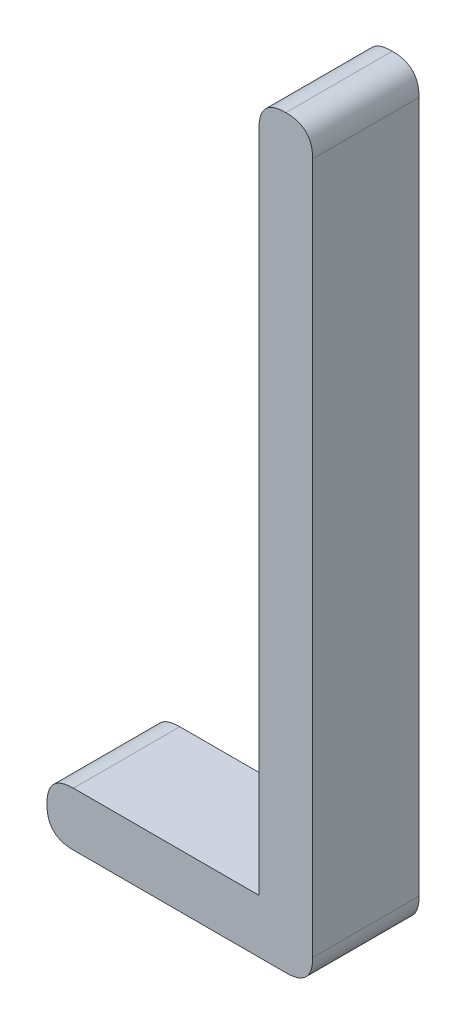
ISO-10303-21;
HEADER;
FILE_DESCRIPTION(('STEP AP214'),'2;1');
FILE_NAME('part.step','',(''),(''),'','','');
FILE_SCHEMA(('AUTOMOTIVE_DESIGN { 1 0 10303 214 1 1 1 1 }'));
ENDSEC;
DATA;
#1=APPLICATION_CONTEXT('core data for automotive mechanical design processes');
#2=APPLICATION_PROTOCOL_DEFINITION('international standard','automotive_design',2000,#1);
#3=PRODUCT_CONTEXT('',#1,'mechanical');
#4=PRODUCT('Part','Part','',(#3));
#5=PRODUCT_RELATED_PRODUCT_CATEGORY('part','',(#4));
#6=PRODUCT_DEFINITION_FORMATION('','',#4);
#7=PRODUCT_DEFINITION_CONTEXT('part definition',#1,'design');
#8=PRODUCT_DEFINITION('design','',#6,#7);
#9=PRODUCT_DEFINITION_SHAPE('','',#8);
#10=(LENGTH_UNIT() NAMED_UNIT(*) SI_UNIT(.MILLI.,.METRE.));
#11=(NAMED_UNIT(*) PLANE_ANGLE_UNIT() SI_UNIT($,.RADIAN.));
#12=(NAMED_UNIT(*) SI_UNIT($,.STERADIAN.) SOLID_ANGLE_UNIT());
#13=UNCERTAINTY_MEASURE_WITH_UNIT(LENGTH_MEASURE(1.E-05),#10,'distance_accuracy_value','');
#14=(GEOMETRIC_REPRESENTATION_CONTEXT(3) GLOBAL_UNCERTAINTY_ASSIGNED_CONTEXT((#13)) GLOBAL_UNIT_ASSIGNED_CONTEXT((#10,
#11,#12)) REPRESENTATION_CONTEXT('',''));
#15=CARTESIAN_POINT('',(0.,0.,0.));
#16=DIRECTION('',(0.,0.,1.));
#17=DIRECTION('',(1.,0.,0.));
#18=AXIS2_PLACEMENT_3D('',#15,#16,#17);
#19=CARTESIAN_POINT('',(20.2879575390394,-16.4550254040573,-0.1));
#20=DIRECTION('',(0.,-1.,0.));
#21=DIRECTION('',(0.,0.,-1.));
#22=AXIS2_PLACEMENT_3D('',#19,#20,#21);
#23=PLANE('',#22);
#24=DIRECTION('',(1.,0.,0.));
#25=VECTOR('',#24,1.);
#26=CARTESIAN_POINT('',(0.,-16.4550254040573,-0.1));
#27=LINE('',#26,#25);
#28=CARTESIAN_POINT('',(20.2879575390394,-16.4550254040573,-0.1));
#29=VERTEX_POINT('',#28);
#30=CARTESIAN_POINT('',(20.4877725390394,-16.4550254040573,-0.1));
#31=VERTEX_POINT('',#30);
#32=EDGE_CURVE('E276',#29,#31,#27,.T.);
#33=ORIENTED_EDGE('',*,*,#32,.T.);
#34=DIRECTION('',(0.,0.,1.));
#35=VECTOR('',#34,1.);
#36=CARTESIAN_POINT('',(20.4877725390394,-16.4550254040573,-0.05));
#37=LINE('',#36,#35);
#38=CARTESIAN_POINT('',(20.4877725390394,-16.4550254040573,0.));
#39=VERTEX_POINT('',#38);
#40=EDGE_CURVE('E110',#31,#39,#37,.T.);
#41=ORIENTED_EDGE('',*,*,#40,.T.);
#42=DIRECTION('',(1.,0.,0.));
#43=VECTOR('',#42,1.);
#44=CARTESIAN_POINT('',(0.,-16.4550254040573,0.));
#45=LINE('',#44,#43);
#46=CARTESIAN_POINT('',(20.2879575390394,-16.4550254040573,0.));
#47=VERTEX_POINT('',#46);
#48=EDGE_CURVE('E108',#47,#39,#45,.T.);
#49=ORIENTED_EDGE('',*,*,#48,.F.);
#50=DIRECTION('',(0.,0.,-1.));
#51=VECTOR('',#50,1.);
#52=CARTESIAN_POINT('',(20.2879575390394,-16.4550254040573,-0.05));
#53=LINE('',#52,#51);
#54=EDGE_CURVE('E96',#47,#29,#53,.T.);
#55=ORIENTED_EDGE('',*,*,#54,.T.);
#56=EDGE_LOOP('',(#33,#41,#49,#55));
#57=FACE_BOUND('',#56,.T.);
#58=ADVANCED_FACE('F17',(#57),#23,.T.);
#59=CARTESIAN_POINT('',(20.4623450390394,-15.7800154040573,-0.1));
#60=DIRECTION('',(-1.,0.,0.));
#61=DIRECTION('',(0.,0.,1.));
#62=AXIS2_PLACEMENT_3D('',#59,#60,#61);
#63=PLANE('',#62);
#64=DIRECTION('',(0.,1.,0.));
#65=VECTOR('',#64,1.);
#66=CARTESIAN_POINT('',(20.4623450390394,0.,-0.1));
#67=LINE('',#66,#65);
#68=CARTESIAN_POINT('',(20.4623450390394,-15.7800154040573,-0.1));
#69=VERTEX_POINT('',#68);
#70=CARTESIAN_POINT('',(20.4623450390394,-16.4046254040573,-0.1));
#71=VERTEX_POINT('',#70);
#72=EDGE_CURVE('E201',#69,#71,#67,.F.);
#73=ORIENTED_EDGE('',*,*,#72,.T.);
#74=DIRECTION('',(0.,0.,1.));
#75=VECTOR('',#74,1.);
#76=CARTESIAN_POINT('',(20.4623450390394,-16.4046254040573,-0.1));
#77=LINE('',#76,#75);
#78=CARTESIAN_POINT('',(20.4623450390394,-16.4046254040573,0.));
#79=VERTEX_POINT('',#78);
#80=EDGE_CURVE('E260',#79,#71,#77,.F.);
#81=ORIENTED_EDGE('',*,*,#80,.F.);
#82=DIRECTION('',(0.,1.,0.));
#83=VECTOR('',#82,1.);
#84=CARTESIAN_POINT('',(20.4623450390394,0.,0.));
#85=LINE('',#84,#83);
#86=CARTESIAN_POINT('',(20.4623450390394,-15.7800154040573,0.));
#87=VERTEX_POINT('',#86);
#88=EDGE_CURVE('E251',#87,#79,#85,.F.);
#89=ORIENTED_EDGE('',*,*,#88,.F.);
#90=DIRECTION('',(0.,0.,-1.));
#91=VECTOR('',#90,1.);
#92=CARTESIAN_POINT('',(20.4623450390394,-15.7800154040573,-0.05));
#93=LINE('',#92,#91);
#94=EDGE_CURVE('E118',#87,#69,#93,.T.);
#95=ORIENTED_EDGE('',*,*,#94,.T.);
#96=EDGE_LOOP('',(#73,#81,#89,#95));
#97=FACE_BOUND('',#96,.T.);
#98=ADVANCED_FACE('F281',(#97),#63,.T.);
#99=CARTESIAN_POINT('',(20.4623450390394,-16.4046254040573,-0.1));
#100=DIRECTION('',(0.,1.,0.));
#101=DIRECTION('',(0.,0.,1.));
#102=AXIS2_PLACEMENT_3D('',#99,#100,#101);
#103=PLANE('',#102);
#104=DIRECTION('',(1.,0.,0.));
#105=VECTOR('',#104,1.);
#106=CARTESIAN_POINT('',(0.,-16.4046254040573,-0.1));
#107=LINE('',#106,#105);
#108=CARTESIAN_POINT('',(20.2879050390394,-16.4046254040573,-0.1));
#109=VERTEX_POINT('',#108);
#110=EDGE_CURVE('E193',#71,#109,#107,.F.);
#111=ORIENTED_EDGE('',*,*,#110,.T.);
#112=DIRECTION('',(0.,0.,1.));
#113=VECTOR('',#112,1.);
#114=CARTESIAN_POINT('',(20.2879050390394,-16.4046254040573,-0.05));
#115=LINE('',#114,#113);
#116=CARTESIAN_POINT('',(20.2879050390394,-16.4046254040573,0.));
#117=VERTEX_POINT('',#116);
#118=EDGE_CURVE('E105',#109,#117,#115,.T.);
#119=ORIENTED_EDGE('',*,*,#118,.T.);
#120=DIRECTION('',(1.,0.,0.));
#121=VECTOR('',#120,1.);
#122=CARTESIAN_POINT('',(0.,-16.4046254040573,0.));
#123=LINE('',#122,#121);
#124=EDGE_CURVE('E171',#79,#117,#123,.F.);
#125=ORIENTED_EDGE('',*,*,#124,.F.);
#126=ORIENTED_EDGE('',*,*,#80,.T.);
#127=EDGE_LOOP('',(#111,#119,#125,#126));
#128=FACE_BOUND('',#127,.T.);
#129=ADVANCED_FACE('F151',(#128),#103,.T.);
#130=CARTESIAN_POINT('',(20.2879050390394,-16.4046254040573,-0.1));
#131=CARTESIAN_POINT('',(20.2629850390394,-16.4046254040573,-0.1));
#132=CARTESIAN_POINT('',(20.2629850390394,-16.4298254040573,-0.1));
#133=CARTESIAN_POINT('',(20.2879050390394,-16.4046254040573,0.));
#134=CARTESIAN_POINT('',(20.2629850390394,-16.4046254040573,0.));
#135=CARTESIAN_POINT('',(20.2629850390394,-16.4298254040573,0.));
#136=B_SPLINE_SURFACE_WITH_KNOTS('',1,2,((#130,#131,#132),(#133,#134,#135)),.UNSPECIFIED.,.F.,
.F.,.F.,(2,2),(3,3),(0.,1.),(0.,1.),.UNSPECIFIED.);
#137=CARTESIAN_POINT('',(20.2879050390394,-16.4046254040573,-0.1));
#138=CARTESIAN_POINT('',(20.2858768002495,-16.4046333777475,-0.1));
#139=CARTESIAN_POINT('',(20.2838180605608,-16.40475303087,-0.1));
#140=CARTESIAN_POINT('',(20.2797199615165,-16.4053732114874,-0.1));
#141=CARTESIAN_POINT('',(20.2776819059397,-16.4058816450367,-0.1));
#142=CARTESIAN_POINT('',(20.2737774460818,-16.4074589811442,-0.1));
#143=CARTESIAN_POINT('',(20.2719133987508,-16.4085345451992,-0.1));
#144=CARTESIAN_POINT('',(20.2686880930748,-16.411296740847,-0.1));
#145=CARTESIAN_POINT('',(20.2673287163813,-16.412985613777,-0.1));
#146=CARTESIAN_POINT('',(20.2649879259198,-16.417104195379,-0.1));
#147=CARTESIAN_POINT('',(20.2641643512231,-16.4196149892998,-0.1));
#148=CARTESIAN_POINT('',(20.2631724441556,-16.4247253502239,-0.1));
#149=CARTESIAN_POINT('',(20.2629916344898,-16.4273222274564,-0.1));
#150=CARTESIAN_POINT('',(20.2629850390394,-16.4298254040573,-0.1));
#151=B_SPLINE_CURVE_WITH_KNOTS('',3,(#137,#138,#139,#140,#141,#142,#143,#144,#145,#146,#147,
#148,#149,#150),.UNSPECIFIED.,.F.,.F.,(4,2,2,2,2,2,4),(0.,0.00613026048980108,
0.0123886115498451,0.0187221665061151,0.0250791042844931,0.0328917712075612,0.0405519251929686),.UNSPECIFIED.);
#152=CARTESIAN_POINT('',(20.2629850390394,-16.4298254040573,-0.1));
#153=VERTEX_POINT('',#152);
#154=EDGE_CURVE('E188',#109,#153,#151,.T.);
#155=DIRECTION('',(0.,0.,1.));
#156=VECTOR('',#155,1.);
#157=CARTESIAN_POINT('',(20.2629850390394,-16.4298254040573,-0.05));
#158=LINE('',#157,#156);
#159=CARTESIAN_POINT('',(20.2629850390394,-16.4298254040573,0.));
#160=VERTEX_POINT('',#159);
#161=EDGE_CURVE('E91',#153,#160,#158,.T.);
#162=CARTESIAN_POINT('',(20.2879050390394,-16.4046254040573,0.));
#163=CARTESIAN_POINT('',(20.2858768002495,-16.4046333777475,0.));
#164=CARTESIAN_POINT('',(20.2838180605608,-16.40475303087,0.));
#165=CARTESIAN_POINT('',(20.2797199615165,-16.4053732114874,0.));
#166=CARTESIAN_POINT('',(20.2776819059397,-16.4058816450367,0.));
#167=CARTESIAN_POINT('',(20.2737774460818,-16.4074589811442,0.));
#168=CARTESIAN_POINT('',(20.2719133987508,-16.4085345451992,0.));
#169=CARTESIAN_POINT('',(20.2686880930748,-16.411296740847,0.));
#170=CARTESIAN_POINT('',(20.2673287163813,-16.412985613777,0.));
#171=CARTESIAN_POINT('',(20.2649879259198,-16.417104195379,0.));
#172=CARTESIAN_POINT('',(20.2641643512231,-16.4196149892998,0.));
#173=CARTESIAN_POINT('',(20.2631724441556,-16.4247253502239,0.));
#174=CARTESIAN_POINT('',(20.2629916344898,-16.4273222274564,0.));
#175=CARTESIAN_POINT('',(20.2629850390394,-16.4298254040573,0.));
#176=B_SPLINE_CURVE_WITH_KNOTS('',3,(#162,#163,#164,#165,#166,#167,#168,#169,#170,#171,#172,
#173,#174,#175),.UNSPECIFIED.,.F.,.F.,(4,2,2,2,2,2,4),(0.,0.00613026048980133,
0.0123886115498444,0.0187221665061145,0.0250791042844924,0.0328917712075605,0.040551925192968),.UNSPECIFIED.);
#177=EDGE_CURVE('E117',#117,#160,#176,.T.);
#178=ORIENTED_EDGE('',*,*,#118,.F.);
#179=ORIENTED_EDGE('',*,*,#154,.T.);
#180=ORIENTED_EDGE('',*,*,#161,.T.);
#181=ORIENTED_EDGE('',*,*,#177,.F.);
#182=EDGE_LOOP('',(#178,#179,#180,#181));
#183=FACE_BOUND('',#182,.T.);
#184=ADVANCED_FACE('F172',(#183),#136,.F.);
#185=CARTESIAN_POINT('',(20.2629850390394,-16.4298254040573,-0.1));
#186=CARTESIAN_POINT('',(20.2629850390394,-16.4550254040573,-0.1));
#187=CARTESIAN_POINT('',(20.2879575390394,-16.4550254040573,-0.1));
#188=CARTESIAN_POINT('',(20.2629850390394,-16.4298254040573,0.));
#189=CARTESIAN_POINT('',(20.2629850390394,-16.4550254040573,0.));
#190=CARTESIAN_POINT('',(20.2879575390394,-16.4550254040573,0.));
#191=B_SPLINE_SURFACE_WITH_KNOTS('',1,2,((#185,#186,#187),(#188,#189,#190)),.UNSPECIFIED.,.F.,
.F.,.F.,(2,2),(3,3),(0.,1.),(0.,1.),.UNSPECIFIED.);
#192=CARTESIAN_POINT('',(20.2629850390394,-16.4298254040573,-0.1));
#193=CARTESIAN_POINT('',(20.2629940038012,-16.4319209951781,-0.1));
#194=CARTESIAN_POINT('',(20.2631172507765,-16.4340506609418,-0.1));
#195=CARTESIAN_POINT('',(20.2637631668013,-16.4382907963856,-0.1));
#196=CARTESIAN_POINT('',(20.2642945678451,-16.440399811744,-0.1));
#197=CARTESIAN_POINT('',(20.2659257624694,-16.4443673084091,-0.1));
#198=CARTESIAN_POINT('',(20.2670140679128,-16.4462299307308,-0.1));
#199=CARTESIAN_POINT('',(20.2698011081492,-16.4494481272841,-0.1));
#200=CARTESIAN_POINT('',(20.2715021594253,-16.4508017369582,-0.1));
#201=CARTESIAN_POINT('',(20.2756339768581,-16.4531145171178,-0.1));
#202=CARTESIAN_POINT('',(20.2781429058364,-16.4539194392599,-0.1));
#203=CARTESIAN_POINT('',(20.2831199123328,-16.4548514635581,-0.1));
#204=CARTESIAN_POINT('',(20.2855794723582,-16.4550203508348,-0.1));
#205=CARTESIAN_POINT('',(20.2879575390394,-16.4550254040573,-0.1));
#206=B_SPLINE_CURVE_WITH_KNOTS('',3,(#192,#193,#194,#195,#196,#197,#198,#199,#200,#201,#202,
#203,#204,#205),.UNSPECIFIED.,.F.,.F.,(4,2,2,2,2,2,4),(0.,0.00633835841973519,
0.0128162308705857,0.0191655597386026,0.0255391485675869,0.0333274919146861,0.0405942283673184),.UNSPECIFIED.);
#207=EDGE_CURVE('E102',#153,#29,#206,.T.);
#208=CARTESIAN_POINT('',(20.2629850390394,-16.4298254040573,0.));
#209=CARTESIAN_POINT('',(20.2629940038012,-16.4319209951781,0.));
#210=CARTESIAN_POINT('',(20.2631172507765,-16.4340506609418,0.));
#211=CARTESIAN_POINT('',(20.2637631668013,-16.4382907963856,0.));
#212=CARTESIAN_POINT('',(20.2642945678451,-16.440399811744,0.));
#213=CARTESIAN_POINT('',(20.2659257624694,-16.4443673084091,0.));
#214=CARTESIAN_POINT('',(20.2670140679128,-16.4462299307308,0.));
#215=CARTESIAN_POINT('',(20.2698011081492,-16.4494481272841,0.));
#216=CARTESIAN_POINT('',(20.2715021594253,-16.4508017369582,0.));
#217=CARTESIAN_POINT('',(20.2756339768581,-16.4531145171178,0.));
#218=CARTESIAN_POINT('',(20.2781429058364,-16.4539194392599,0.));
#219=CARTESIAN_POINT('',(20.2831199123328,-16.4548514635581,0.));
#220=CARTESIAN_POINT('',(20.2855794723582,-16.4550203508348,0.));
#221=CARTESIAN_POINT('',(20.2879575390394,-16.4550254040573,0.));
#222=B_SPLINE_CURVE_WITH_KNOTS('',3,(#208,#209,#210,#211,#212,#213,#214,#215,#216,#217,#218,
#219,#220,#221),.UNSPECIFIED.,.F.,.F.,(4,2,2,2,2,2,4),(0.,0.00633835841973519,
0.0128162308705857,0.0191655597386026,0.0255391485675869,0.0333274919146861,0.0405942283673184),.UNSPECIFIED.);
#223=EDGE_CURVE('E24',#160,#47,#222,.T.);
#224=ORIENTED_EDGE('',*,*,#161,.F.);
#225=ORIENTED_EDGE('',*,*,#207,.T.);
#226=ORIENTED_EDGE('',*,*,#54,.F.);
#227=ORIENTED_EDGE('',*,*,#223,.F.);
#228=EDGE_LOOP('',(#224,#225,#226,#227));
#229=FACE_BOUND('',#228,.T.);
#230=ADVANCED_FACE('F98',(#229),#191,.F.);
#231=CARTESIAN_POINT('',(20.4875450390394,-15.7550254040573,-0.1));
#232=CARTESIAN_POINT('',(20.4623450390394,-15.7550254040573,-0.1));
#233=CARTESIAN_POINT('',(20.4623450390394,-15.7800154040573,-0.1));
#234=CARTESIAN_POINT('',(20.4875450390394,-15.7550254040573,0.));
#235=CARTESIAN_POINT('',(20.4623450390394,-15.7550254040573,0.));
#236=CARTESIAN_POINT('',(20.4623450390394,-15.7800154040573,0.));
#237=B_SPLINE_SURFACE_WITH_KNOTS('',1,2,((#231,#232,#233),(#234,#235,#236)),.UNSPECIFIED.,.F.,
.F.,.F.,(2,2),(3,3),(0.,1.),(0.,1.),.UNSPECIFIED.);
#238=DIRECTION('',(0.,0.,-1.));
#239=VECTOR('',#238,1.);
#240=CARTESIAN_POINT('',(20.4875450390394,-15.7550254040573,-0.05));
#241=LINE('',#240,#239);
#242=CARTESIAN_POINT('',(20.4875450390394,-15.7550254040573,0.));
#243=VERTEX_POINT('',#242);
#244=CARTESIAN_POINT('',(20.4875450390394,-15.7550254040573,-0.1));
#245=VERTEX_POINT('',#244);
#246=EDGE_CURVE('E258',#243,#245,#241,.T.);
#247=CARTESIAN_POINT('',(20.4875450390394,-15.7550254040573,-0.1));
#248=CARTESIAN_POINT('',(20.4854509989182,-15.7550343358809,-0.1));
#249=CARTESIAN_POINT('',(20.4833230013977,-15.7551575059889,-0.1));
#250=CARTESIAN_POINT('',(20.4790862186752,-15.7558027652821,-0.1));
#251=CARTESIAN_POINT('',(20.4769788828449,-15.7563335597332,-0.1));
#252=CARTESIAN_POINT('',(20.4730120346648,-15.7579634845441,-0.1));
#253=CARTESIAN_POINT('',(20.4711486167445,-15.7590517729026,-0.1));
#254=CARTESIAN_POINT('',(20.4679288798755,-15.7618390470135,-0.1));
#255=CARTESIAN_POINT('',(20.4665745234274,-15.7635403476588,-0.1));
#256=CARTESIAN_POINT('',(20.4642598454758,-15.7676733323671,-0.1));
#257=CARTESIAN_POINT('',(20.463453954345,-15.7701833093904,-0.1));
#258=CARTESIAN_POINT('',(20.4625195106555,-15.775166858865,-0.1));
#259=CARTESIAN_POINT('',(20.4623501427114,-15.7776320947763,-0.1));
#260=CARTESIAN_POINT('',(20.4623450390394,-15.7800154040573,-0.1));
#261=B_SPLINE_CURVE_WITH_KNOTS('',3,(#247,#248,#249,#250,#251,#252,#253,#254,#255,#256,#257,
#258,#259,#260),.UNSPECIFIED.,.F.,.F.,(4,2,2,2,2,2,4),(0.,0.00633350416974213,
0.0128061629194501,0.0191574692673772,0.0255330155642479,0.0333252555174502,0.040608368401483),.UNSPECIFIED.);
#262=EDGE_CURVE('E197',#245,#69,#261,.T.);
#263=CARTESIAN_POINT('',(20.4875450390394,-15.7550254040573,0.));
#264=CARTESIAN_POINT('',(20.4854509989182,-15.7550343358809,0.));
#265=CARTESIAN_POINT('',(20.4833230013977,-15.7551575059889,0.));
#266=CARTESIAN_POINT('',(20.4790862186752,-15.7558027652821,0.));
#267=CARTESIAN_POINT('',(20.4769788828449,-15.7563335597332,0.));
#268=CARTESIAN_POINT('',(20.4730120346648,-15.7579634845441,0.));
#269=CARTESIAN_POINT('',(20.4711486167445,-15.7590517729026,0.));
#270=CARTESIAN_POINT('',(20.4679288798755,-15.7618390470135,0.));
#271=CARTESIAN_POINT('',(20.4665745234274,-15.7635403476588,0.));
#272=CARTESIAN_POINT('',(20.4642598454758,-15.7676733323671,0.));
#273=CARTESIAN_POINT('',(20.463453954345,-15.7701833093904,0.));
#274=CARTESIAN_POINT('',(20.4625195106555,-15.775166858865,0.));
#275=CARTESIAN_POINT('',(20.4623501427114,-15.7776320947763,0.));
#276=CARTESIAN_POINT('',(20.4623450390394,-15.7800154040573,0.));
#277=B_SPLINE_CURVE_WITH_KNOTS('',3,(#263,#264,#265,#266,#267,#268,#269,#270,#271,#272,#273,
#274,#275,#276),.UNSPECIFIED.,.F.,.F.,(4,2,2,2,2,2,4),(0.,0.00633350416974213,
0.0128061629194501,0.0191574692673772,0.0255330155642479,0.0333252555174502,0.040608368401483),.UNSPECIFIED.);
#278=EDGE_CURVE('E113',#243,#87,#277,.T.);
#279=ORIENTED_EDGE('',*,*,#246,.T.);
#280=ORIENTED_EDGE('',*,*,#262,.T.);
#281=ORIENTED_EDGE('',*,*,#94,.F.);
#282=ORIENTED_EDGE('',*,*,#278,.F.);
#283=EDGE_LOOP('',(#279,#280,#281,#282));
#284=FACE_BOUND('',#283,.T.);
#285=ADVANCED_FACE('F147',(#284),#237,.F.);
#286=CARTESIAN_POINT('',(0.,0.,0.));
#287=DIRECTION('',(0.,0.,1.));
#288=DIRECTION('',(1.,0.,0.));
#289=AXIS2_PLACEMENT_3D('',#286,#287,#288);
#290=PLANE('',#289);
#291=ORIENTED_EDGE('',*,*,#124,.T.);
#292=ORIENTED_EDGE('',*,*,#177,.T.);
#293=ORIENTED_EDGE('',*,*,#223,.T.);
#294=ORIENTED_EDGE('',*,*,#48,.T.);
#295=CARTESIAN_POINT('',(20.4877725390394,-16.4550254040573,0.));
#296=CARTESIAN_POINT('',(20.4898263055695,-16.4550169949311,0.));
#297=CARTESIAN_POINT('',(20.4919121435598,-16.454896006518,0.));
#298=CARTESIAN_POINT('',(20.4960645739422,-16.4542655943327,0.));
#299=CARTESIAN_POINT('',(20.4981297965878,-16.4537479040602,0.));
#300=CARTESIAN_POINT('',(20.5020517617321,-16.452150097363,0.));
#301=CARTESIAN_POINT('',(20.5039091933305,-16.4510719112286,0.));
#302=CARTESIAN_POINT('',(20.5071208524079,-16.4483067121332,0.));
#303=CARTESIAN_POINT('',(20.5084731641278,-16.4466174281863,0.));
#304=CARTESIAN_POINT('',(20.51079303703,-16.442505798524,0.));
#305=CARTESIAN_POINT('',(20.5116050193284,-16.4400040494085,0.));
#306=CARTESIAN_POINT('',(20.5125647455035,-16.4349746366057,0.));
#307=CARTESIAN_POINT('',(20.5127392446379,-16.4324525897731,0.));
#308=CARTESIAN_POINT('',(20.5127450390394,-16.4300179040573,0.));
#309=B_SPLINE_CURVE_WITH_KNOTS('',3,(#295,#296,#297,#298,#299,#300,#301,#302,#303,#304,#305,
#306,#307,#308),.UNSPECIFIED.,.F.,.F.,(4,2,2,2,2,2,4),(0.,0.0062095129372398,0.0125520616122291,
0.018872910504221,0.0252174946441479,0.0329931157640912,0.0404383805252992),.UNSPECIFIED.);
#310=CARTESIAN_POINT('',(20.5127450390394,-16.4300179040573,0.));
#311=VERTEX_POINT('',#310);
#312=EDGE_CURVE('E130',#39,#311,#309,.T.);
#313=ORIENTED_EDGE('',*,*,#312,.T.);
#314=DIRECTION('',(0.,1.,0.));
#315=VECTOR('',#314,1.);
#316=CARTESIAN_POINT('',(20.5127450390394,-16.4300179040573,0.));
#317=LINE('',#316,#315);
#318=CARTESIAN_POINT('',(20.5127450390394,-15.7800329040573,0.));
#319=VERTEX_POINT('',#318);
#320=EDGE_CURVE('E137',#319,#311,#317,.F.);
#321=ORIENTED_EDGE('',*,*,#320,.F.);
#322=CARTESIAN_POINT('',(20.5127450390394,-15.7800329040573,0.));
#323=CARTESIAN_POINT('',(20.512736889633,-15.7779899241409,0.));
#324=CARTESIAN_POINT('',(20.5126164259172,-15.77591580349,0.));
#325=CARTESIAN_POINT('',(20.5119908737868,-15.7717869509647,0.));
#326=CARTESIAN_POINT('',(20.5114777299304,-15.7697335497802,0.));
#327=CARTESIAN_POINT('',(20.5098887264176,-15.7658120239977,0.));
#328=CARTESIAN_POINT('',(20.5088092487008,-15.7639451836277,0.));
#329=CARTESIAN_POINT('',(20.5060383337909,-15.7607158306392,0.));
#330=CARTESIAN_POINT('',(20.5043446382196,-15.7593552172314,0.));
#331=CARTESIAN_POINT('',(20.5002171692151,-15.7570154623782,0.));
#332=CARTESIAN_POINT('',(20.497702695183,-15.7561937775238,0.));
#333=CARTESIAN_POINT('',(20.4926074267507,-15.7552107590115,0.));
#334=CARTESIAN_POINT('',(20.4900304133013,-15.7550317206444,0.));
#335=CARTESIAN_POINT('',(20.4875450390394,-15.7550254040573,0.));
#336=B_SPLINE_CURVE_WITH_KNOTS('',3,(#322,#323,#324,#325,#326,#327,#328,#329,#330,#331,#332,
#333,#334,#335),.UNSPECIFIED.,.F.,.F.,(4,2,2,2,2,2,4),(0.,0.00617555295362307,0.012481304189946,
0.0188278396858584,0.0251979509500718,0.0330188630002551,0.0406225830086264),.UNSPECIFIED.);
#337=EDGE_CURVE('E131',#319,#243,#336,.T.);
#338=ORIENTED_EDGE('',*,*,#337,.T.);
#339=ORIENTED_EDGE('',*,*,#278,.T.);
#340=ORIENTED_EDGE('',*,*,#88,.T.);
#341=EDGE_LOOP('',(#291,#292,#293,#294,#313,#321,#338,#339,#340));
#342=FACE_BOUND('',#341,.T.);
#343=ADVANCED_FACE('F116',(#342),#290,.T.);
#344=CARTESIAN_POINT('',(20.4877725390394,-16.4550254040573,-0.1));
#345=CARTESIAN_POINT('',(20.5127450390394,-16.4550254040573,-0.1));
#346=CARTESIAN_POINT('',(20.5127450390394,-16.4300179040573,-0.1));
#347=CARTESIAN_POINT('',(20.4877725390394,-16.4550254040573,0.));
#348=CARTESIAN_POINT('',(20.5127450390394,-16.4550254040573,0.));
#349=CARTESIAN_POINT('',(20.5127450390394,-16.4300179040573,0.));
#350=B_SPLINE_SURFACE_WITH_KNOTS('',1,2,((#344,#345,#346),(#347,#348,#349)),.UNSPECIFIED.,.F.,
.F.,.F.,(2,2),(3,3),(0.,1.),(0.,1.),.UNSPECIFIED.);
#351=CARTESIAN_POINT('',(20.4877725390394,-16.4550254040573,-0.1));
#352=CARTESIAN_POINT('',(20.4898263055695,-16.4550169949311,-0.1));
#353=CARTESIAN_POINT('',(20.4919121435598,-16.454896006518,-0.1));
#354=CARTESIAN_POINT('',(20.4960645739422,-16.4542655943327,-0.1));
#355=CARTESIAN_POINT('',(20.4981297965878,-16.4537479040602,-0.1));
#356=CARTESIAN_POINT('',(20.5020517617321,-16.452150097363,-0.1));
#357=CARTESIAN_POINT('',(20.5039091933305,-16.4510719112286,-0.1));
#358=CARTESIAN_POINT('',(20.5071208524079,-16.4483067121332,-0.1));
#359=CARTESIAN_POINT('',(20.5084731641278,-16.4466174281863,-0.1));
#360=CARTESIAN_POINT('',(20.51079303703,-16.442505798524,-0.1));
#361=CARTESIAN_POINT('',(20.5116050193284,-16.4400040494085,-0.1));
#362=CARTESIAN_POINT('',(20.5125647455035,-16.4349746366057,-0.1));
#363=CARTESIAN_POINT('',(20.5127392446379,-16.4324525897731,-0.1));
#364=CARTESIAN_POINT('',(20.5127450390394,-16.4300179040573,-0.1));
#365=B_SPLINE_CURVE_WITH_KNOTS('',3,(#351,#352,#353,#354,#355,#356,#357,#358,#359,#360,#361,
#362,#363,#364),.UNSPECIFIED.,.F.,.F.,(4,2,2,2,2,2,4),(0.,0.00620951293724005,
0.0125520616122285,0.0188729105042204,0.0252174946441472,0.0329931157640905,0.0404383805252986),.UNSPECIFIED.);
#366=CARTESIAN_POINT('',(20.5127450390394,-16.4300179040573,-0.1));
#367=VERTEX_POINT('',#366);
#368=EDGE_CURVE('E202',#31,#367,#365,.T.);
#369=DIRECTION('',(0.,0.,-1.));
#370=VECTOR('',#369,1.);
#371=CARTESIAN_POINT('',(20.5127450390394,-16.4300179040573,-0.1));
#372=LINE('',#371,#370);
#373=EDGE_CURVE('E243',#311,#367,#372,.T.);
#374=ORIENTED_EDGE('',*,*,#40,.F.);
#375=ORIENTED_EDGE('',*,*,#368,.T.);
#376=ORIENTED_EDGE('',*,*,#373,.F.);
#377=ORIENTED_EDGE('',*,*,#312,.F.);
#378=EDGE_LOOP('',(#374,#375,#376,#377));
#379=FACE_BOUND('',#378,.T.);
#380=ADVANCED_FACE('F146',(#379),#350,.F.);
#381=CARTESIAN_POINT('',(0.,0.,-0.1));
#382=DIRECTION('',(0.,0.,1.));
#383=DIRECTION('',(1.,0.,0.));
#384=AXIS2_PLACEMENT_3D('',#381,#382,#383);
#385=PLANE('',#384);
#386=ORIENTED_EDGE('',*,*,#154,.F.);
#387=ORIENTED_EDGE('',*,*,#110,.F.);
#388=ORIENTED_EDGE('',*,*,#72,.F.);
#389=ORIENTED_EDGE('',*,*,#262,.F.);
#390=CARTESIAN_POINT('',(20.4875450390394,-15.7550254040573,-0.1));
#391=CARTESIAN_POINT('',(20.4896375298625,-15.7550343030946,-0.1));
#392=CARTESIAN_POINT('',(20.4917638613243,-15.7551573963143,-0.1));
#393=CARTESIAN_POINT('',(20.4959972958805,-15.755801999853,-0.1));
#394=CARTESIAN_POINT('',(20.4981029545314,-15.7563321888185,-0.1));
#395=CARTESIAN_POINT('',(20.5020691536184,-15.7579608461143,-0.1));
#396=CARTESIAN_POINT('',(20.5039333650549,-15.759049117004,-0.1));
#397=CARTESIAN_POINT('',(20.5071546382996,-15.7618366234427,-0.1));
#398=CARTESIAN_POINT('',(20.5085097396683,-15.7635381722855,-0.1));
#399=CARTESIAN_POINT('',(20.5108263127874,-15.7676723217904,-0.1));
#400=CARTESIAN_POINT('',(20.5116331719959,-15.7701833456444,-0.1));
#401=CARTESIAN_POINT('',(20.5125700361203,-15.7751734377073,-0.1));
#402=CARTESIAN_POINT('',(20.5127398845784,-15.7776443515772,-0.1));
#403=CARTESIAN_POINT('',(20.5127450390394,-15.7800329040573,-0.1));
#404=B_SPLINE_CURVE_WITH_KNOTS('',3,(#390,#391,#392,#393,#394,#395,#396,#397,#398,#399,#400,
#401,#402,#403),.UNSPECIFIED.,.F.,.F.,(4,2,2,2,2,2,4),(0.,0.00632865589769378,
0.0127961082036655,0.0191493863521959,0.0255268843609907,0.0333230170829414,0.0406225102328534),.UNSPECIFIED.);
#405=CARTESIAN_POINT('',(20.5127450390394,-15.7800329040573,-0.1));
#406=VERTEX_POINT('',#405);
#407=EDGE_CURVE('E44',#245,#406,#404,.T.);
#408=ORIENTED_EDGE('',*,*,#407,.T.);
#409=DIRECTION('',(0.,1.,0.));
#410=VECTOR('',#409,1.);
#411=CARTESIAN_POINT('',(20.5127450390394,-16.4300179040573,-0.1));
#412=LINE('',#411,#410);
#413=EDGE_CURVE('E35',#367,#406,#412,.T.);
#414=ORIENTED_EDGE('',*,*,#413,.F.);
#415=ORIENTED_EDGE('',*,*,#368,.F.);
#416=ORIENTED_EDGE('',*,*,#32,.F.);
#417=ORIENTED_EDGE('',*,*,#207,.F.);
#418=EDGE_LOOP('',(#386,#387,#388,#389,#408,#414,#415,#416,#417));
#419=FACE_BOUND('',#418,.T.);
#420=ADVANCED_FACE('F148',(#419),#385,.F.);
#421=CARTESIAN_POINT('',(20.5127450390394,-15.7800329040573,-0.1));
#422=CARTESIAN_POINT('',(20.5127450390394,-15.7550254040573,-0.1));
#423=CARTESIAN_POINT('',(20.4875450390394,-15.7550254040573,-0.1));
#424=CARTESIAN_POINT('',(20.5127450390394,-15.7800329040573,0.));
#425=CARTESIAN_POINT('',(20.5127450390394,-15.7550254040573,0.));
#426=CARTESIAN_POINT('',(20.4875450390394,-15.7550254040573,0.));
#427=B_SPLINE_SURFACE_WITH_KNOTS('',1,2,((#421,#422,#423),(#424,#425,#426)),.UNSPECIFIED.,.F.,
.F.,.F.,(2,2),(3,3),(0.,1.),(0.,1.),.UNSPECIFIED.);
#428=DIRECTION('',(0.,0.,-1.));
#429=VECTOR('',#428,1.);
#430=CARTESIAN_POINT('',(20.5127450390394,-15.7800329040573,-0.1));
#431=LINE('',#430,#429);
#432=EDGE_CURVE('E11',#406,#319,#431,.F.);
#433=ORIENTED_EDGE('',*,*,#432,.F.);
#434=ORIENTED_EDGE('',*,*,#407,.F.);
#435=ORIENTED_EDGE('',*,*,#246,.F.);
#436=ORIENTED_EDGE('',*,*,#337,.F.);
#437=EDGE_LOOP('',(#433,#434,#435,#436));
#438=FACE_BOUND('',#437,.T.);
#439=ADVANCED_FACE('F19',(#438),#427,.F.);
#440=CARTESIAN_POINT('',(20.5127450390394,-16.4300179040573,-0.1));
#441=DIRECTION('',(1.,0.,0.));
#442=DIRECTION('',(0.,0.,-1.));
#443=AXIS2_PLACEMENT_3D('',#440,#441,#442);
#444=PLANE('',#443);
#445=ORIENTED_EDGE('',*,*,#413,.T.);
#446=ORIENTED_EDGE('',*,*,#432,.T.);
#447=ORIENTED_EDGE('',*,*,#320,.T.);
#448=ORIENTED_EDGE('',*,*,#373,.T.);
#449=EDGE_LOOP('',(#445,#446,#447,#448));
#450=FACE_BOUND('',#449,.T.);
#451=ADVANCED_FACE('F232',(#450),#444,.T.);
#452=CLOSED_SHELL('',(#58,#98,#129,#184,#230,#285,#343,#380,#420,#439,#451));
#453=MANIFOLD_SOLID_BREP('B1',#452);
#454=ADVANCED_BREP_SHAPE_REPRESENTATION('',(#18,#453),#14);
#455=SHAPE_DEFINITION_REPRESENTATION(#9,#454);
ENDSEC;
END-ISO-10303-21;
